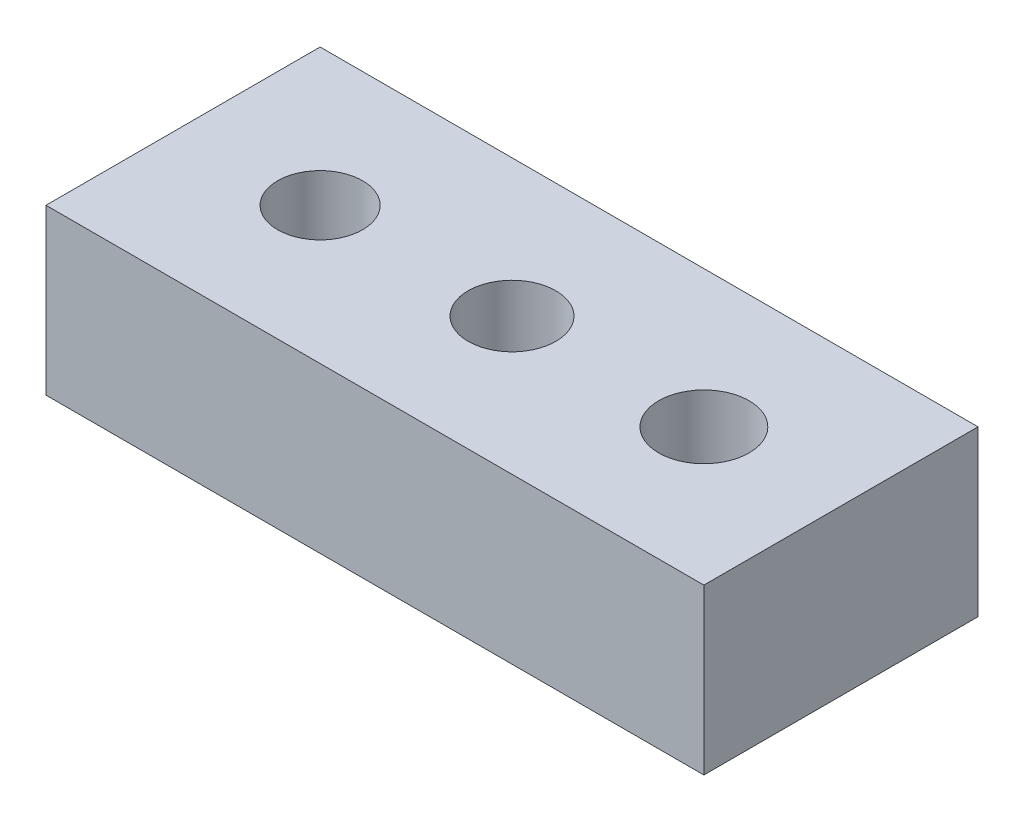
ISO-10303-21;
HEADER;
FILE_DESCRIPTION(('STEP AP214'),'2;1');
FILE_NAME('part.step','',(''),(''),'','','');
FILE_SCHEMA(('AUTOMOTIVE_DESIGN { 1 0 10303 214 1 1 1 1 }'));
ENDSEC;
DATA;
#1=APPLICATION_CONTEXT('core data for automotive mechanical design processes');
#2=APPLICATION_PROTOCOL_DEFINITION('international standard','automotive_design',2000,#1);
#3=PRODUCT_CONTEXT('',#1,'mechanical');
#4=PRODUCT('Part','Part','',(#3));
#5=PRODUCT_RELATED_PRODUCT_CATEGORY('part','',(#4));
#6=PRODUCT_DEFINITION_FORMATION('','',#4);
#7=PRODUCT_DEFINITION_CONTEXT('part definition',#1,'design');
#8=PRODUCT_DEFINITION('design','',#6,#7);
#9=PRODUCT_DEFINITION_SHAPE('','',#8);
#10=(LENGTH_UNIT() NAMED_UNIT(*) SI_UNIT(.MILLI.,.METRE.));
#11=(NAMED_UNIT(*) PLANE_ANGLE_UNIT() SI_UNIT($,.RADIAN.));
#12=(NAMED_UNIT(*) SI_UNIT($,.STERADIAN.) SOLID_ANGLE_UNIT());
#13=UNCERTAINTY_MEASURE_WITH_UNIT(LENGTH_MEASURE(1.E-05),#10,'distance_accuracy_value','');
#14=(GEOMETRIC_REPRESENTATION_CONTEXT(3) GLOBAL_UNCERTAINTY_ASSIGNED_CONTEXT((#13)) GLOBAL_UNIT_ASSIGNED_CONTEXT((#10,
#11,#12)) REPRESENTATION_CONTEXT('',''));
#15=CARTESIAN_POINT('',(0.,0.,0.));
#16=DIRECTION('',(0.,0.,1.));
#17=DIRECTION('',(1.,0.,0.));
#18=AXIS2_PLACEMENT_3D('',#15,#16,#17);
#19=CARTESIAN_POINT('',(0.,6.,0.));
#20=DIRECTION('',(0.,-1.,0.));
#21=DIRECTION('',(0.,0.,-1.));
#22=AXIS2_PLACEMENT_3D('',#19,#20,#21);
#23=PLANE('',#22);
#24=DIRECTION('',(0.,0.,1.));
#25=VECTOR('',#24,1.);
#26=CARTESIAN_POINT('',(0.,6.,0.));
#27=LINE('',#26,#25);
#28=CARTESIAN_POINT('',(0.,6.,-10.));
#29=VERTEX_POINT('',#28);
#30=CARTESIAN_POINT('',(0.,6.,0.));
#31=VERTEX_POINT('',#30);
#32=EDGE_CURVE('E92',#29,#31,#27,.T.);
#33=ORIENTED_EDGE('',*,*,#32,.T.);
#34=DIRECTION('',(1.,0.,0.));
#35=VECTOR('',#34,1.);
#36=CARTESIAN_POINT('',(0.,6.,0.));
#37=LINE('',#36,#35);
#38=CARTESIAN_POINT('',(24.,6.,0.));
#39=VERTEX_POINT('',#38);
#40=EDGE_CURVE('E87',#31,#39,#37,.T.);
#41=ORIENTED_EDGE('',*,*,#40,.T.);
#42=DIRECTION('',(0.,0.,-1.));
#43=VECTOR('',#42,1.);
#44=CARTESIAN_POINT('',(24.,6.,0.));
#45=LINE('',#44,#43);
#46=CARTESIAN_POINT('',(24.,6.,-10.));
#47=VERTEX_POINT('',#46);
#48=EDGE_CURVE('E90',#39,#47,#45,.T.);
#49=ORIENTED_EDGE('',*,*,#48,.T.);
#50=DIRECTION('',(-1.,0.,0.));
#51=VECTOR('',#50,1.);
#52=CARTESIAN_POINT('',(0.,6.,-10.));
#53=LINE('',#52,#51);
#54=EDGE_CURVE('E57',#47,#29,#53,.T.);
#55=ORIENTED_EDGE('',*,*,#54,.T.);
#56=EDGE_LOOP('',(#33,#41,#49,#55));
#57=FACE_BOUND('',#56,.T.);
#58=CARTESIAN_POINT('',(5.,6.,-5.));
#59=DIRECTION('',(0.,1.,0.));
#60=DIRECTION('',(0.,0.,1.));
#61=AXIS2_PLACEMENT_3D('',#58,#59,#60);
#62=CIRCLE('',#61,1.55);
#63=CARTESIAN_POINT('',(5.,6.,-3.45));
#64=VERTEX_POINT('',#63);
#65=EDGE_CURVE('E112',#64,#64,#62,.T.);
#66=ORIENTED_EDGE('',*,*,#65,.F.);
#67=EDGE_LOOP('',(#66));
#68=FACE_BOUND('',#67,.T.);
#69=CARTESIAN_POINT('',(12.,6.,-5.));
#70=DIRECTION('',(0.,1.,0.));
#71=DIRECTION('',(0.,0.,1.));
#72=AXIS2_PLACEMENT_3D('',#69,#70,#71);
#73=CIRCLE('',#72,1.6);
#74=CARTESIAN_POINT('',(12.,6.,-3.4));
#75=VERTEX_POINT('',#74);
#76=EDGE_CURVE('E134',#75,#75,#73,.T.);
#77=ORIENTED_EDGE('',*,*,#76,.F.);
#78=EDGE_LOOP('',(#77));
#79=FACE_BOUND('',#78,.T.);
#80=CARTESIAN_POINT('',(19.,6.,-5.));
#81=DIRECTION('',(0.,1.,0.));
#82=DIRECTION('',(0.,0.,1.));
#83=AXIS2_PLACEMENT_3D('',#80,#81,#82);
#84=CIRCLE('',#83,1.65);
#85=CARTESIAN_POINT('',(19.,6.,-3.35));
#86=VERTEX_POINT('',#85);
#87=EDGE_CURVE('E142',#86,#86,#84,.T.);
#88=ORIENTED_EDGE('',*,*,#87,.F.);
#89=EDGE_LOOP('',(#88));
#90=FACE_BOUND('',#89,.T.);
#91=ADVANCED_FACE('F39',(#57,#68,#79,#90),#23,.F.);
#92=CARTESIAN_POINT('',(0.,0.,0.));
#93=DIRECTION('',(0.,-1.,0.));
#94=DIRECTION('',(0.,0.,-1.));
#95=AXIS2_PLACEMENT_3D('',#92,#93,#94);
#96=PLANE('',#95);
#97=CARTESIAN_POINT('',(12.,0.,-5.));
#98=DIRECTION('',(0.,1.,0.));
#99=DIRECTION('',(0.,0.,1.));
#100=AXIS2_PLACEMENT_3D('',#97,#98,#99);
#101=CIRCLE('',#100,1.6);
#102=CARTESIAN_POINT('',(12.,0.,-3.4));
#103=VERTEX_POINT('',#102);
#104=EDGE_CURVE('E138',#103,#103,#101,.T.);
#105=ORIENTED_EDGE('',*,*,#104,.T.);
#106=EDGE_LOOP('',(#105));
#107=FACE_BOUND('',#106,.T.);
#108=DIRECTION('',(0.,0.,1.));
#109=VECTOR('',#108,1.);
#110=CARTESIAN_POINT('',(0.,0.,0.));
#111=LINE('',#110,#109);
#112=CARTESIAN_POINT('',(0.,0.,-10.));
#113=VERTEX_POINT('',#112);
#114=CARTESIAN_POINT('',(0.,0.,0.));
#115=VERTEX_POINT('',#114);
#116=EDGE_CURVE('E108',#113,#115,#111,.T.);
#117=ORIENTED_EDGE('',*,*,#116,.F.);
#118=DIRECTION('',(-1.,0.,0.));
#119=VECTOR('',#118,1.);
#120=CARTESIAN_POINT('',(0.,0.,-10.));
#121=LINE('',#120,#119);
#122=CARTESIAN_POINT('',(24.,0.,-10.));
#123=VERTEX_POINT('',#122);
#124=EDGE_CURVE('E80',#123,#113,#121,.T.);
#125=ORIENTED_EDGE('',*,*,#124,.F.);
#126=DIRECTION('',(0.,0.,-1.));
#127=VECTOR('',#126,1.);
#128=CARTESIAN_POINT('',(24.,0.,0.));
#129=LINE('',#128,#127);
#130=CARTESIAN_POINT('',(24.,0.,0.));
#131=VERTEX_POINT('',#130);
#132=EDGE_CURVE('E74',#131,#123,#129,.T.);
#133=ORIENTED_EDGE('',*,*,#132,.F.);
#134=DIRECTION('',(1.,0.,0.));
#135=VECTOR('',#134,1.);
#136=CARTESIAN_POINT('',(0.,0.,0.));
#137=LINE('',#136,#135);
#138=EDGE_CURVE('E97',#115,#131,#137,.T.);
#139=ORIENTED_EDGE('',*,*,#138,.F.);
#140=EDGE_LOOP('',(#117,#125,#133,#139));
#141=FACE_BOUND('',#140,.T.);
#142=CARTESIAN_POINT('',(5.,0.,-5.));
#143=DIRECTION('',(0.,1.,0.));
#144=DIRECTION('',(0.,0.,1.));
#145=AXIS2_PLACEMENT_3D('',#142,#143,#144);
#146=CIRCLE('',#145,1.55);
#147=CARTESIAN_POINT('',(5.,0.,-3.45));
#148=VERTEX_POINT('',#147);
#149=EDGE_CURVE('E130',#148,#148,#146,.T.);
#150=ORIENTED_EDGE('',*,*,#149,.T.);
#151=EDGE_LOOP('',(#150));
#152=FACE_BOUND('',#151,.T.);
#153=CARTESIAN_POINT('',(19.,0.,-5.));
#154=DIRECTION('',(0.,1.,0.));
#155=DIRECTION('',(0.,0.,1.));
#156=AXIS2_PLACEMENT_3D('',#153,#154,#155);
#157=CIRCLE('',#156,1.65);
#158=CARTESIAN_POINT('',(19.,0.,-3.35));
#159=VERTEX_POINT('',#158);
#160=EDGE_CURVE('E146',#159,#159,#157,.T.);
#161=ORIENTED_EDGE('',*,*,#160,.T.);
#162=EDGE_LOOP('',(#161));
#163=FACE_BOUND('',#162,.T.);
#164=ADVANCED_FACE('F125',(#107,#141,#152,#163),#96,.T.);
#165=CARTESIAN_POINT('',(0.,6.,0.));
#166=DIRECTION('',(1.,0.,0.));
#167=DIRECTION('',(0.,0.,-1.));
#168=AXIS2_PLACEMENT_3D('',#165,#166,#167);
#169=PLANE('',#168);
#170=ORIENTED_EDGE('',*,*,#116,.T.);
#171=DIRECTION('',(0.,-1.,0.));
#172=VECTOR('',#171,1.);
#173=CARTESIAN_POINT('',(0.,6.,0.));
#174=LINE('',#173,#172);
#175=EDGE_CURVE('E11',#31,#115,#174,.T.);
#176=ORIENTED_EDGE('',*,*,#175,.F.);
#177=ORIENTED_EDGE('',*,*,#32,.F.);
#178=DIRECTION('',(0.,-1.,0.));
#179=VECTOR('',#178,1.);
#180=CARTESIAN_POINT('',(0.,6.,-10.));
#181=LINE('',#180,#179);
#182=EDGE_CURVE('E104',#29,#113,#181,.T.);
#183=ORIENTED_EDGE('',*,*,#182,.T.);
#184=EDGE_LOOP('',(#170,#176,#177,#183));
#185=FACE_BOUND('',#184,.T.);
#186=ADVANCED_FACE('F41',(#185),#169,.F.);
#187=CARTESIAN_POINT('',(0.,6.,0.));
#188=DIRECTION('',(0.,0.,-1.));
#189=DIRECTION('',(-1.,0.,0.));
#190=AXIS2_PLACEMENT_3D('',#187,#188,#189);
#191=PLANE('',#190);
#192=ORIENTED_EDGE('',*,*,#138,.T.);
#193=DIRECTION('',(0.,-1.,0.));
#194=VECTOR('',#193,1.);
#195=CARTESIAN_POINT('',(24.,6.,0.));
#196=LINE('',#195,#194);
#197=EDGE_CURVE('E49',#39,#131,#196,.T.);
#198=ORIENTED_EDGE('',*,*,#197,.F.);
#199=ORIENTED_EDGE('',*,*,#40,.F.);
#200=ORIENTED_EDGE('',*,*,#175,.T.);
#201=EDGE_LOOP('',(#192,#198,#199,#200));
#202=FACE_BOUND('',#201,.T.);
#203=ADVANCED_FACE('F96',(#202),#191,.F.);
#204=CARTESIAN_POINT('',(24.,6.,0.));
#205=DIRECTION('',(-1.,0.,0.));
#206=DIRECTION('',(0.,0.,1.));
#207=AXIS2_PLACEMENT_3D('',#204,#205,#206);
#208=PLANE('',#207);
#209=ORIENTED_EDGE('',*,*,#132,.T.);
#210=DIRECTION('',(0.,-1.,0.));
#211=VECTOR('',#210,1.);
#212=CARTESIAN_POINT('',(24.,6.,-10.));
#213=LINE('',#212,#211);
#214=EDGE_CURVE('E99',#47,#123,#213,.T.);
#215=ORIENTED_EDGE('',*,*,#214,.F.);
#216=ORIENTED_EDGE('',*,*,#48,.F.);
#217=ORIENTED_EDGE('',*,*,#197,.T.);
#218=EDGE_LOOP('',(#209,#215,#216,#217));
#219=FACE_BOUND('',#218,.T.);
#220=ADVANCED_FACE('F100',(#219),#208,.F.);
#221=CARTESIAN_POINT('',(0.,6.,-10.));
#222=DIRECTION('',(0.,0.,1.));
#223=DIRECTION('',(1.,0.,0.));
#224=AXIS2_PLACEMENT_3D('',#221,#222,#223);
#225=PLANE('',#224);
#226=ORIENTED_EDGE('',*,*,#124,.T.);
#227=ORIENTED_EDGE('',*,*,#182,.F.);
#228=ORIENTED_EDGE('',*,*,#54,.F.);
#229=ORIENTED_EDGE('',*,*,#214,.T.);
#230=EDGE_LOOP('',(#226,#227,#228,#229));
#231=FACE_BOUND('',#230,.T.);
#232=ADVANCED_FACE('F122',(#231),#225,.F.);
#233=CARTESIAN_POINT('',(5.,6.,-5.));
#234=DIRECTION('',(0.,-1.,0.));
#235=DIRECTION('',(0.,0.,-1.));
#236=AXIS2_PLACEMENT_3D('',#233,#234,#235);
#237=CYLINDRICAL_SURFACE('',#236,1.55);
#238=ORIENTED_EDGE('',*,*,#65,.T.);
#239=EDGE_LOOP('',(#238));
#240=FACE_BOUND('',#239,.T.);
#241=ORIENTED_EDGE('',*,*,#149,.F.);
#242=EDGE_LOOP('',(#241));
#243=FACE_BOUND('',#242,.T.);
#244=ADVANCED_FACE('F165',(#240,#243),#237,.F.);
#245=CARTESIAN_POINT('',(12.,6.,-5.));
#246=DIRECTION('',(0.,-1.,0.));
#247=DIRECTION('',(0.,0.,-1.));
#248=AXIS2_PLACEMENT_3D('',#245,#246,#247);
#249=CYLINDRICAL_SURFACE('',#248,1.6);
#250=ORIENTED_EDGE('',*,*,#76,.T.);
#251=EDGE_LOOP('',(#250));
#252=FACE_BOUND('',#251,.T.);
#253=ORIENTED_EDGE('',*,*,#104,.F.);
#254=EDGE_LOOP('',(#253));
#255=FACE_BOUND('',#254,.T.);
#256=ADVANCED_FACE('F211',(#252,#255),#249,.F.);
#257=CARTESIAN_POINT('',(19.,6.,-5.));
#258=DIRECTION('',(0.,-1.,0.));
#259=DIRECTION('',(0.,0.,-1.));
#260=AXIS2_PLACEMENT_3D('',#257,#258,#259);
#261=CYLINDRICAL_SURFACE('',#260,1.65);
#262=ORIENTED_EDGE('',*,*,#87,.T.);
#263=EDGE_LOOP('',(#262));
#264=FACE_BOUND('',#263,.T.);
#265=ORIENTED_EDGE('',*,*,#160,.F.);
#266=EDGE_LOOP('',(#265));
#267=FACE_BOUND('',#266,.T.);
#268=ADVANCED_FACE('F154',(#264,#267),#261,.F.);
#269=CLOSED_SHELL('',(#91,#164,#186,#203,#220,#232,#244,#256,#268));
#270=MANIFOLD_SOLID_BREP('B2',#269);
#271=ADVANCED_BREP_SHAPE_REPRESENTATION('',(#18,#270),#14);
#272=SHAPE_DEFINITION_REPRESENTATION(#9,#271);
ENDSEC;
END-ISO-10303-21;
